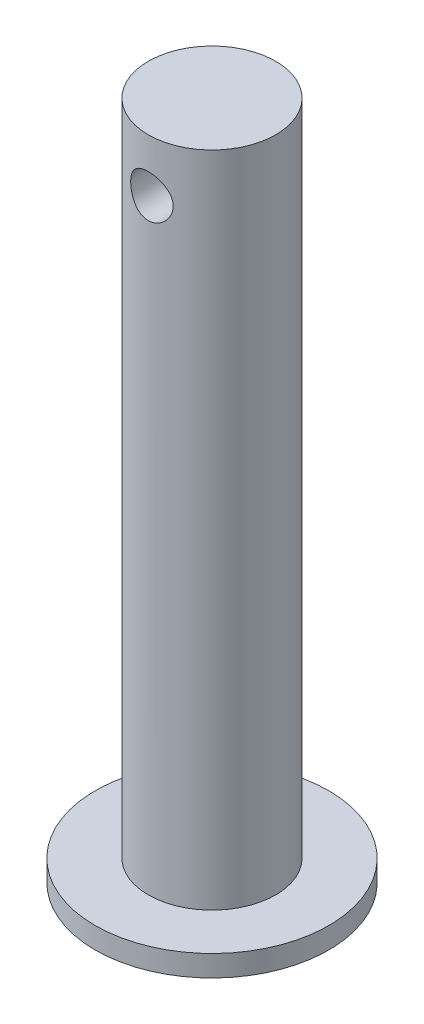
ISO-10303-21;
HEADER;
FILE_DESCRIPTION(('STEP AP214'),'2;1');
FILE_NAME('part.step','',(''),(''),'','','');
FILE_SCHEMA(('AUTOMOTIVE_DESIGN { 1 0 10303 214 1 1 1 1 }'));
ENDSEC;
DATA;
#1=APPLICATION_CONTEXT('core data for automotive mechanical design processes');
#2=APPLICATION_PROTOCOL_DEFINITION('international standard','automotive_design',2000,#1);
#3=PRODUCT_CONTEXT('',#1,'mechanical');
#4=PRODUCT('Part','Part','',(#3));
#5=PRODUCT_RELATED_PRODUCT_CATEGORY('part','',(#4));
#6=PRODUCT_DEFINITION_FORMATION('','',#4);
#7=PRODUCT_DEFINITION_CONTEXT('part definition',#1,'design');
#8=PRODUCT_DEFINITION('design','',#6,#7);
#9=PRODUCT_DEFINITION_SHAPE('','',#8);
#10=(LENGTH_UNIT() NAMED_UNIT(*) SI_UNIT(.MILLI.,.METRE.));
#11=(NAMED_UNIT(*) PLANE_ANGLE_UNIT() SI_UNIT($,.RADIAN.));
#12=(NAMED_UNIT(*) SI_UNIT($,.STERADIAN.) SOLID_ANGLE_UNIT());
#13=UNCERTAINTY_MEASURE_WITH_UNIT(LENGTH_MEASURE(1.E-05),#10,'distance_accuracy_value','');
#14=(GEOMETRIC_REPRESENTATION_CONTEXT(3) GLOBAL_UNCERTAINTY_ASSIGNED_CONTEXT((#13)) GLOBAL_UNIT_ASSIGNED_CONTEXT((#10,
#11,#12)) REPRESENTATION_CONTEXT('',''));
#15=CARTESIAN_POINT('',(0.,0.,0.));
#16=DIRECTION('',(0.,0.,1.));
#17=DIRECTION('',(1.,0.,0.));
#18=AXIS2_PLACEMENT_3D('',#15,#16,#17);
#19=CARTESIAN_POINT('',(0.,1.,0.));
#20=DIRECTION('',(0.,-1.,0.));
#21=DIRECTION('',(0.,0.,-1.));
#22=AXIS2_PLACEMENT_3D('',#19,#20,#21);
#23=CYLINDRICAL_SURFACE('',#22,5.50000000000001);
#24=CARTESIAN_POINT('',(0.,1.,0.));
#25=DIRECTION('',(0.,1.,0.));
#26=DIRECTION('',(0.,0.,1.));
#27=AXIS2_PLACEMENT_3D('',#24,#25,#26);
#28=CIRCLE('',#27,5.50000000000001);
#29=CARTESIAN_POINT('',(0.,1.,5.50000000000001));
#30=VERTEX_POINT('',#29);
#31=EDGE_CURVE('E56',#30,#30,#28,.T.);
#32=ORIENTED_EDGE('',*,*,#31,.F.);
#33=EDGE_LOOP('',(#32));
#34=FACE_BOUND('',#33,.T.);
#35=CARTESIAN_POINT('',(0.,0.,0.));
#36=DIRECTION('',(0.,1.,0.));
#37=DIRECTION('',(0.,0.,1.));
#38=AXIS2_PLACEMENT_3D('',#35,#36,#37);
#39=CIRCLE('',#38,5.50000000000001);
#40=CARTESIAN_POINT('',(0.,0.,5.50000000000001));
#41=VERTEX_POINT('',#40);
#42=EDGE_CURVE('E62',#41,#41,#39,.T.);
#43=ORIENTED_EDGE('',*,*,#42,.T.);
#44=EDGE_LOOP('',(#43));
#45=FACE_BOUND('',#44,.T.);
#46=ADVANCED_FACE('F43',(#34,#45),#23,.T.);
#47=CARTESIAN_POINT('',(0.,1.,0.));
#48=DIRECTION('',(0.,1.,0.));
#49=DIRECTION('',(0.,0.,1.));
#50=AXIS2_PLACEMENT_3D('',#47,#48,#49);
#51=PLANE('',#50);
#52=CARTESIAN_POINT('',(0.,1.,0.));
#53=DIRECTION('',(0.,1.,0.));
#54=DIRECTION('',(0.,0.,1.));
#55=AXIS2_PLACEMENT_3D('',#52,#53,#54);
#56=CIRCLE('',#55,3.);
#57=CARTESIAN_POINT('',(0.,1.,3.));
#58=VERTEX_POINT('',#57);
#59=EDGE_CURVE('E10',#58,#58,#56,.T.);
#60=ORIENTED_EDGE('',*,*,#59,.F.);
#61=EDGE_LOOP('',(#60));
#62=FACE_BOUND('',#61,.T.);
#63=ORIENTED_EDGE('',*,*,#31,.T.);
#64=EDGE_LOOP('',(#63));
#65=FACE_BOUND('',#64,.T.);
#66=ADVANCED_FACE('F95',(#62,#65),#51,.T.);
#67=CARTESIAN_POINT('',(0.,0.,0.));
#68=DIRECTION('',(0.,1.,0.));
#69=DIRECTION('',(0.,0.,1.));
#70=AXIS2_PLACEMENT_3D('',#67,#68,#69);
#71=PLANE('',#70);
#72=ORIENTED_EDGE('',*,*,#42,.F.);
#73=EDGE_LOOP('',(#72));
#74=FACE_BOUND('',#73,.T.);
#75=ADVANCED_FACE('F91',(#74),#71,.F.);
#76=CARTESIAN_POINT('',(0.,32.,0.));
#77=DIRECTION('',(0.,-1.,0.));
#78=DIRECTION('',(0.,0.,-1.));
#79=AXIS2_PLACEMENT_3D('',#76,#77,#78);
#80=CYLINDRICAL_SURFACE('',#79,3.);
#81=CARTESIAN_POINT('',(0.,30.5,-3.));
#82=CARTESIAN_POINT('',(-0.0545633628867232,30.5000002537316,-3.00000015300943));
#83=CARTESIAN_POINT('',(-0.10912519453855,30.4955197338728,-2.99849769507545));
#84=CARTESIAN_POINT('',(-0.216641760872972,30.4777708911828,-2.99265210203281));
#85=CARTESIAN_POINT('',(-0.269596328118818,30.4645016560511,-2.98830867202153));
#86=CARTESIAN_POINT('',(-0.372332789501777,30.429680756616,-2.97725307906443));
#87=CARTESIAN_POINT('',(-0.422119825886035,30.4081429375407,-2.97054487730853));
#88=CARTESIAN_POINT('',(-0.517374936805326,30.3574588271617,-2.95544445717342));
#89=CARTESIAN_POINT('',(-0.562842156958707,30.3283110349974,-2.94705190667778));
#90=CARTESIAN_POINT('',(-0.649741675022268,30.2621741951412,-2.92914094443005));
#91=CARTESIAN_POINT('',(-0.691003700298311,30.2249687657395,-2.91959556463785));
#92=CARTESIAN_POINT('',(-0.766832692702085,30.1442328452934,-2.90060314783121));
#93=CARTESIAN_POINT('',(-0.801398185489463,30.1007009650715,-2.89115613290549));
#94=CARTESIAN_POINT('',(-0.863824942227859,30.0070148848035,-2.87313332477274));
#95=CARTESIAN_POINT('',(-0.891464858221031,29.9567062602679,-2.86459039275688));
#96=CARTESIAN_POINT('',(-0.937818873877721,29.8518239055415,-2.84975305418601));
#97=CARTESIAN_POINT('',(-0.956535697386765,29.7972514828373,-2.84345796160746));
#98=CARTESIAN_POINT('',(-0.983873461509164,29.6873267785033,-2.83411303269377));
#99=CARTESIAN_POINT('',(-0.992813448271769,29.6320627915109,-2.83096095769611));
#100=CARTESIAN_POINT('',(-1.00134112333448,29.5207362458441,-2.82795656629508));
#101=CARTESIAN_POINT('',(-1.00093170160472,29.4646739392908,-2.8281032302273));
#102=CARTESIAN_POINT('',(-0.991019903703419,29.356063369556,-2.8315901500818));
#103=CARTESIAN_POINT('',(-0.981933913166994,29.303471597081,-2.83478415867533));
#104=CARTESIAN_POINT('',(-0.955606162849417,29.2006065803932,-2.84376657724551));
#105=CARTESIAN_POINT('',(-0.938363426591871,29.1503336145649,-2.84955529784108));
#106=CARTESIAN_POINT('',(-0.895939058060211,29.0525872504085,-2.86317911131249));
#107=CARTESIAN_POINT('',(-0.870634048707263,29.0051719745305,-2.87104565793117));
#108=CARTESIAN_POINT('',(-0.812889106303139,28.9151290917203,-2.88792558575726));
#109=CARTESIAN_POINT('',(-0.780447112364006,28.8725028730666,-2.89693929790464));
#110=CARTESIAN_POINT('',(-0.707349332682238,28.7909084018392,-2.91567329167741));
#111=CARTESIAN_POINT('',(-0.666353150076312,28.7522473054909,-2.92540589354843));
#112=CARTESIAN_POINT('',(-0.578339569970064,28.6822687333366,-2.94406938387037));
#113=CARTESIAN_POINT('',(-0.531321595660815,28.6509519618355,-2.95300019538067));
#114=CARTESIAN_POINT('',(-0.431947613046268,28.5963036997649,-2.96917107937794));
#115=CARTESIAN_POINT('',(-0.379543276416338,28.5730545086593,-2.97639350008039));
#116=CARTESIAN_POINT('',(-0.271269083364509,28.5357968260443,-2.98820567144435));
#117=CARTESIAN_POINT('',(-0.215400438154955,28.5217851245766,-2.99279633654879));
#118=CARTESIAN_POINT('',(-0.104383829529304,28.5039443339776,-2.99867627071441));
#119=CARTESIAN_POINT('',(-0.0493095998648455,28.4997001908273,-3.00010001833731));
#120=CARTESIAN_POINT('',(0.0607750699602368,28.5003326735985,-2.99988902694825));
#121=CARTESIAN_POINT('',(0.115785519319648,28.5052077599799,-2.99825480419352));
#122=CARTESIAN_POINT('',(0.222519866304259,28.523611907736,-2.99220024717114));
#123=CARTESIAN_POINT('',(0.274292806834856,28.5368862060495,-2.98786198711228));
#124=CARTESIAN_POINT('',(0.374855958579561,28.5713934444667,-2.97691846830034));
#125=CARTESIAN_POINT('',(0.42364578850856,28.5926273994677,-2.97031292046541));
#126=CARTESIAN_POINT('',(0.518288296393322,28.6430704318409,-2.95528931287427));
#127=CARTESIAN_POINT('',(0.564029959217331,28.6724745932836,-2.94682814756305));
#128=CARTESIAN_POINT('',(0.650064830135405,28.7381941500131,-2.92905253915743));
#129=CARTESIAN_POINT('',(0.690356367794895,28.7745116560302,-2.91973783591888));
#130=CARTESIAN_POINT('',(0.766252507807016,28.8549787510083,-2.90076847982472));
#131=CARTESIAN_POINT('',(0.801560969248495,28.8994092269333,-2.89111761095155));
#132=CARTESIAN_POINT('',(0.864257522320857,28.9937715678045,-2.87299973286981));
#133=CARTESIAN_POINT('',(0.891645547920845,29.0437034786102,-2.8645327335312));
#134=CARTESIAN_POINT('',(0.937596930423361,29.1476730153066,-2.84982391820308));
#135=CARTESIAN_POINT('',(0.956178132197766,29.2017020792428,-2.84357760900632));
#136=CARTESIAN_POINT('',(0.983894666792163,29.3123786501241,-2.83410832399133));
#137=CARTESIAN_POINT('',(0.993034254961244,29.3690249654331,-2.83088398622698));
#138=CARTESIAN_POINT('',(1.00127628247038,29.4801970960132,-2.82797858875071));
#139=CARTESIAN_POINT('',(1.00087025731093,29.5346823402517,-2.82812400344299));
#140=CARTESIAN_POINT('',(0.991242293454878,29.6427650748997,-2.8315126992356));
#141=CARTESIAN_POINT('',(0.982020879458887,29.6963626179529,-2.83475579595884));
#142=CARTESIAN_POINT('',(0.95537181312698,29.8001356630127,-2.84384524278943));
#143=CARTESIAN_POINT('',(0.93810334601488,29.8503568250072,-2.84964098015514));
#144=CARTESIAN_POINT('',(0.895979365760383,29.9472274069355,-2.86316398825434));
#145=CARTESIAN_POINT('',(0.87112216855398,29.9938760311873,-2.87089168765297));
#146=CARTESIAN_POINT('',(0.813260692583249,30.0844836699237,-2.8878282922406));
#147=CARTESIAN_POINT('',(0.779948242764532,30.1282365018986,-2.89708711641604));
#148=CARTESIAN_POINT('',(0.706642883135697,30.209689813384,-2.91583356283786));
#149=CARTESIAN_POINT('',(0.666648084451496,30.247388575688,-2.92532124912518));
#150=CARTESIAN_POINT('',(0.579241556920676,30.3171444122892,-2.94390030525393));
#151=CARTESIAN_POINT('',(0.531601513499727,30.348924347751,-2.95296181801216));
#152=CARTESIAN_POINT('',(0.431357357406629,30.4039904288506,-2.96925991172652));
#153=CARTESIAN_POINT('',(0.37875451813235,30.427278745922,-2.9764969590794));
#154=CARTESIAN_POINT('',(0.272493647200975,30.4637216324887,-2.98805515068532));
#155=CARTESIAN_POINT('',(0.218987757676408,30.4772824662634,-2.9924921242252));
#156=CARTESIAN_POINT('',(0.110320416010247,30.4954202806771,-2.99846407064225));
#157=CARTESIAN_POINT('',(0.0551594255687463,30.4999997434965,-2.99999984531906));
#158=CARTESIAN_POINT('',(0.,30.5,-3.));
#159=B_SPLINE_CURVE_WITH_KNOTS('',3,(#81,#82,#83,#84,#85,#86,#87,#88,#89,#90,#91,#92,#93,#94,
#95,#96,#97,#98,#99,#100,#101,#102,#103,#104,#105,#106,#107,#108,#109,#110,#111,#112,#113,#114,
#115,#116,#117,#118,#119,#120,#121,#122,#123,#124,#125,#126,#127,#128,#129,#130,#131,#132,#133,
#134,#135,#136,#137,#138,#139,#140,#141,#142,#143,#144,#145,#146,#147,#148,#149,#150,#151,#152,
#153,#154,#155,#156,#157,#158),.UNSPECIFIED.,.T.,.F.,(4,2,2,2,2,2,2,2,2,2,2,2,2,2,2,2,2,2,2,2,2,
2,2,2,2,2,2,2,2,2,2,2,2,2,2,2,2,2,4),(0.,0.163487106026011,0.326991185267521,0.490222672870276,
0.653486377799101,0.821846842827563,0.990244332875302,1.1634838482347,1.33667044692834,
1.5040192574184,1.67131633987486,1.8309682655128,1.99063930855482,2.1528817115513,
2.31517102558207,2.48593305811367,2.65671145966618,2.82918405650357,3.00159668877208,
3.1665358317517,3.33144713164177,3.49158157978213,3.65173645284104,3.81610399843737,
3.98052180821891,4.15241022880752,4.32430008234997,4.49584013824416,4.66730284700845,
4.82995666056618,4.99260079341185,5.15215587070227,5.31174638165787,5.47830066681615,
5.64490211113589,5.8179966082491,5.99104681142266,6.15636558363624,6.3216386602795),.UNSPECIFIED.);
#160=CARTESIAN_POINT('',(0.,30.5,-3.));
#161=VERTEX_POINT('',#160);
#162=EDGE_CURVE('E46',#161,#161,#159,.T.);
#163=ORIENTED_EDGE('',*,*,#162,.T.);
#164=EDGE_LOOP('',(#163));
#165=FACE_BOUND('',#164,.T.);
#166=CARTESIAN_POINT('',(1.,29.5,2.82842712474619));
#167=CARTESIAN_POINT('',(1.0000002579478,29.4455318251893,2.82842694532735));
#168=CARTESIAN_POINT('',(0.99553478369814,29.3910652002285,2.83001769372806));
#169=CARTESIAN_POINT('',(0.977851131702564,29.2837455790494,2.8361757417458));
#170=CARTESIAN_POINT('',(0.964631512170674,29.2308928501361,2.8407435316722));
#171=CARTESIAN_POINT('',(0.929955485680262,29.1283731069872,2.85228203663888));
#172=CARTESIAN_POINT('',(0.908515221401999,29.0787000705531,2.8592480396464));
#173=CARTESIAN_POINT('',(0.858061628442625,28.9836399514562,2.87479122017008));
#174=CARTESIAN_POINT('',(0.829046628860521,28.9382538174475,2.88336875305432));
#175=CARTESIAN_POINT('',(0.763051146442525,28.8512800376605,2.90154489405589));
#176=CARTESIAN_POINT('',(0.725824341377822,28.809884571328,2.91116894844139));
#177=CARTESIAN_POINT('',(0.644987667214487,28.7337931987757,2.93013864801509));
#178=CARTESIAN_POINT('',(0.6013767750524,28.6990983684177,2.93948424829099));
#179=CARTESIAN_POINT('',(0.507604507964984,28.6365211026703,2.95713866921658));
#180=CARTESIAN_POINT('',(0.457301911224518,28.608840029382,2.96541407701568));
#181=CARTESIAN_POINT('',(0.35243122298748,28.5624084148725,2.97969586771021));
#182=CARTESIAN_POINT('',(0.297864285687212,28.5436554668231,2.98570286203012));
#183=CARTESIAN_POINT('',(0.188028817433491,28.5162641453676,2.99459075431897));
#184=CARTESIAN_POINT('',(0.132850754852966,28.507296553743,2.99757314777558));
#185=CARTESIAN_POINT('',(0.0216978748240898,28.4986837066393,3.00043608218249));
#186=CARTESIAN_POINT('',(-0.034276733543894,28.4990360483476,3.00031742262891));
#187=CARTESIAN_POINT('',(-0.143103515193818,28.508844254566,2.99706039618736));
#188=CARTESIAN_POINT('',(-0.195992048591668,28.5179425284745,2.99404064755135));
#189=CARTESIAN_POINT('',(-0.299443438822161,28.5443929809805,2.98546967339714));
#190=CARTESIAN_POINT('',(-0.350006137779176,28.5617457189798,2.97991827631115));
#191=CARTESIAN_POINT('',(-0.448152474842015,28.6044213173061,2.96675670293292));
#192=CARTESIAN_POINT('',(-0.495688220969,28.6298459385468,2.9591204252427));
#193=CARTESIAN_POINT('',(-0.585924325527171,28.6878597054484,2.94258393038665));
#194=CARTESIAN_POINT('',(-0.62862333438477,28.7204508433266,2.93368336200518));
#195=CARTESIAN_POINT('',(-0.710100866551907,28.7936743934607,2.9150619185089));
#196=CARTESIAN_POINT('',(-0.748600157067557,28.8346131578454,2.90532215172667));
#197=CARTESIAN_POINT('',(-0.81827725959589,28.9224487257227,2.88647335245111));
#198=CARTESIAN_POINT('',(-0.849453943273005,28.9693464457132,2.8773644173145));
#199=CARTESIAN_POINT('',(-0.903987455042732,29.0686536256154,2.86070525135531));
#200=CARTESIAN_POINT('',(-0.92722646365105,29.1211321313678,2.85317909338821));
#201=CARTESIAN_POINT('',(-0.964443193299507,29.2295713942663,2.84081650878299));
#202=CARTESIAN_POINT('',(-0.97842479575553,29.2855306812218,2.83597895501223));
#203=CARTESIAN_POINT('',(-0.996161282090474,29.3966383554006,2.8297963630207));
#204=CARTESIAN_POINT('',(-1.00034909550575,29.4517094247457,2.82830360315139));
#205=CARTESIAN_POINT('',(-0.999605438911604,29.561776149117,2.828566720628));
#206=CARTESIAN_POINT('',(-0.994675625227259,29.6167718160248,2.83032200792768));
#207=CARTESIAN_POINT('',(-0.976225651551829,29.7231569657112,2.83673618089379));
#208=CARTESIAN_POINT('',(-0.963006393980555,29.7746054301506,2.84129325440593));
#209=CARTESIAN_POINT('',(-0.928713862560596,29.8745436062394,2.8526855367127));
#210=CARTESIAN_POINT('',(-0.907639196363457,29.9230327915908,2.85952114934907));
#211=CARTESIAN_POINT('',(-0.857474340738901,30.0173804208469,2.87496877595718));
#212=CARTESIAN_POINT('',(-0.828151118358487,30.0631066426418,2.8836302566561));
#213=CARTESIAN_POINT('',(-0.762585630557567,30.1491460523837,2.90165768730984));
#214=CARTESIAN_POINT('',(-0.726341325498784,30.1894576386612,2.911023844438));
#215=CARTESIAN_POINT('',(-0.64589170590032,30.2655279840906,2.92995038637844));
#216=CARTESIAN_POINT('',(-0.601387270546648,30.3009743900189,2.93949843577895));
#217=CARTESIAN_POINT('',(-0.506827291400254,30.363916142348,2.9572685161311));
#218=CARTESIAN_POINT('',(-0.456771944864549,30.3914117711624,2.96549059417695));
#219=CARTESIAN_POINT('',(-0.352779862432293,30.4374201048617,2.97964405810603));
#220=CARTESIAN_POINT('',(-0.298871123321195,30.4559912771481,2.98559030004531));
#221=CARTESIAN_POINT('',(-0.188458465846015,30.4837277420601,2.99458610837774));
#222=CARTESIAN_POINT('',(-0.131955491953887,30.4928964298805,2.99763672034018));
#223=CARTESIAN_POINT('',(-0.0208153358600388,30.5012620776056,3.00041863236257));
#224=CARTESIAN_POINT('',(0.0337847239200205,30.5009074539324,3.00029920089441));
#225=CARTESIAN_POINT('',(0.142111145000175,30.4913426918536,2.99712196519396));
#226=CARTESIAN_POINT('',(0.195837576819057,30.4821332718472,2.99406439933567));
#227=CARTESIAN_POINT('',(0.300042119432062,30.455417765424,2.98540914954421));
#228=CARTESIAN_POINT('',(0.350558270912797,30.438045784647,2.9798525836118));
#229=CARTESIAN_POINT('',(0.447978350939791,30.3956224689029,2.96677160704464));
#230=CARTESIAN_POINT('',(0.494881624142411,30.3705697448031,2.95924684047901));
#231=CARTESIAN_POINT('',(0.585634016308811,30.3124304878979,2.94265868828001));
#232=CARTESIAN_POINT('',(0.629306251557698,30.2790813146181,2.93354872492381));
#233=CARTESIAN_POINT('',(0.71058102627234,30.2057426088441,2.91492988791425));
#234=CARTESIAN_POINT('',(0.74818162162426,30.1657509577383,2.90542088771397));
#235=CARTESIAN_POINT('',(0.817741808833465,30.078390644412,2.88663279827365));
#236=CARTESIAN_POINT('',(0.849422965999218,30.0307944890192,2.87737727995345));
#237=CARTESIAN_POINT('',(0.9043143432998,29.9306655731013,2.86060193316303));
#238=CARTESIAN_POINT('',(0.92752677681456,29.8781341069858,2.8530816513617));
#239=CARTESIAN_POINT('',(0.963843828206627,29.7720381759762,2.84101334230535));
#240=CARTESIAN_POINT('',(0.977357909163268,29.7186277364343,2.83634632944799));
#241=CARTESIAN_POINT('',(0.995434320161694,29.6101439494845,2.83005383613939));
#242=CARTESIAN_POINT('',(0.999999739196502,29.5550711825643,2.82842730615135));
#243=CARTESIAN_POINT('',(1.,29.5,2.82842712474619));
#244=B_SPLINE_CURVE_WITH_KNOTS('',3,(#166,#167,#168,#169,#170,#171,#172,#173,#174,#175,#176,
#177,#178,#179,#180,#181,#182,#183,#184,#185,#186,#187,#188,#189,#190,#191,#192,#193,#194,#195,
#196,#197,#198,#199,#200,#201,#202,#203,#204,#205,#206,#207,#208,#209,#210,#211,#212,#213,#214,
#215,#216,#217,#218,#219,#220,#221,#222,#223,#224,#225,#226,#227,#228,#229,#230,#231,#232,#233,
#234,#235,#236,#237,#238,#239,#240,#241,#242,#243),.UNSPECIFIED.,.T.,.F.,(4,2,2,2,2,2,2,2,2,2,2,
2,2,2,2,2,2,2,2,2,2,2,2,2,2,2,2,2,2,2,2,2,2,2,2,2,2,2,4),(0.,0.163200584775416,
0.326428054968882,0.489336627454547,0.652281166139164,0.821013374229401,0.989772651673597,
1.16293506139029,1.33605076382161,1.50314318760306,1.67019253297699,1.83069004820941,
1.99119844184608,2.15381654855707,2.31647991869394,2.48680174359289,2.65714979607478,
2.82992639837376,3.00263051349689,3.16754291357513,3.33242535830307,3.49164395761849,
3.65089079140019,3.81518857728788,3.979534856552,4.15178808164166,4.32403518750605,
4.49513791183925,4.6661788299723,4.82918084670708,4.99216964002854,5.15256956033503,
5.31299850756316,5.47935519513707,5.64576504425705,5.81868902729218,5.9915677825994,
6.15663212153686,6.32163947179229),.UNSPECIFIED.);
#245=CARTESIAN_POINT('',(1.,29.5,2.82842712474619));
#246=VERTEX_POINT('',#245);
#247=EDGE_CURVE('E69',#246,#246,#244,.T.);
#248=ORIENTED_EDGE('',*,*,#247,.T.);
#249=EDGE_LOOP('',(#248));
#250=FACE_BOUND('',#249,.T.);
#251=CARTESIAN_POINT('',(0.,32.,0.));
#252=DIRECTION('',(0.,1.,0.));
#253=DIRECTION('',(0.,0.,1.));
#254=AXIS2_PLACEMENT_3D('',#251,#252,#253);
#255=CIRCLE('',#254,3.);
#256=CARTESIAN_POINT('',(0.,32.,3.));
#257=VERTEX_POINT('',#256);
#258=EDGE_CURVE('E65',#257,#257,#255,.T.);
#259=ORIENTED_EDGE('',*,*,#258,.F.);
#260=EDGE_LOOP('',(#259));
#261=FACE_BOUND('',#260,.T.);
#262=ORIENTED_EDGE('',*,*,#59,.T.);
#263=EDGE_LOOP('',(#262));
#264=FACE_BOUND('',#263,.T.);
#265=ADVANCED_FACE('F75',(#165,#250,#261,#264),#80,.T.);
#266=CARTESIAN_POINT('',(0.,32.,0.));
#267=DIRECTION('',(0.,1.,0.));
#268=DIRECTION('',(0.,0.,1.));
#269=AXIS2_PLACEMENT_3D('',#266,#267,#268);
#270=PLANE('',#269);
#271=ORIENTED_EDGE('',*,*,#258,.T.);
#272=EDGE_LOOP('',(#271));
#273=FACE_BOUND('',#272,.T.);
#274=ADVANCED_FACE('F82',(#273),#270,.T.);
#275=CARTESIAN_POINT('',(0.,29.5,-15.5));
#276=DIRECTION('',(0.,0.,1.));
#277=DIRECTION('',(1.,0.,0.));
#278=AXIS2_PLACEMENT_3D('',#275,#276,#277);
#279=CYLINDRICAL_SURFACE('',#278,1.);
#280=ORIENTED_EDGE('',*,*,#247,.F.);
#281=EDGE_LOOP('',(#280));
#282=FACE_BOUND('',#281,.T.);
#283=ORIENTED_EDGE('',*,*,#162,.F.);
#284=EDGE_LOOP('',(#283));
#285=FACE_BOUND('',#284,.T.);
#286=ADVANCED_FACE('F79',(#282,#285),#279,.F.);
#287=CLOSED_SHELL('',(#46,#66,#75,#265,#274,#286));
#288=MANIFOLD_SOLID_BREP('B2',#287);
#289=ADVANCED_BREP_SHAPE_REPRESENTATION('',(#18,#288),#14);
#290=SHAPE_DEFINITION_REPRESENTATION(#9,#289);
ENDSEC;
END-ISO-10303-21;
